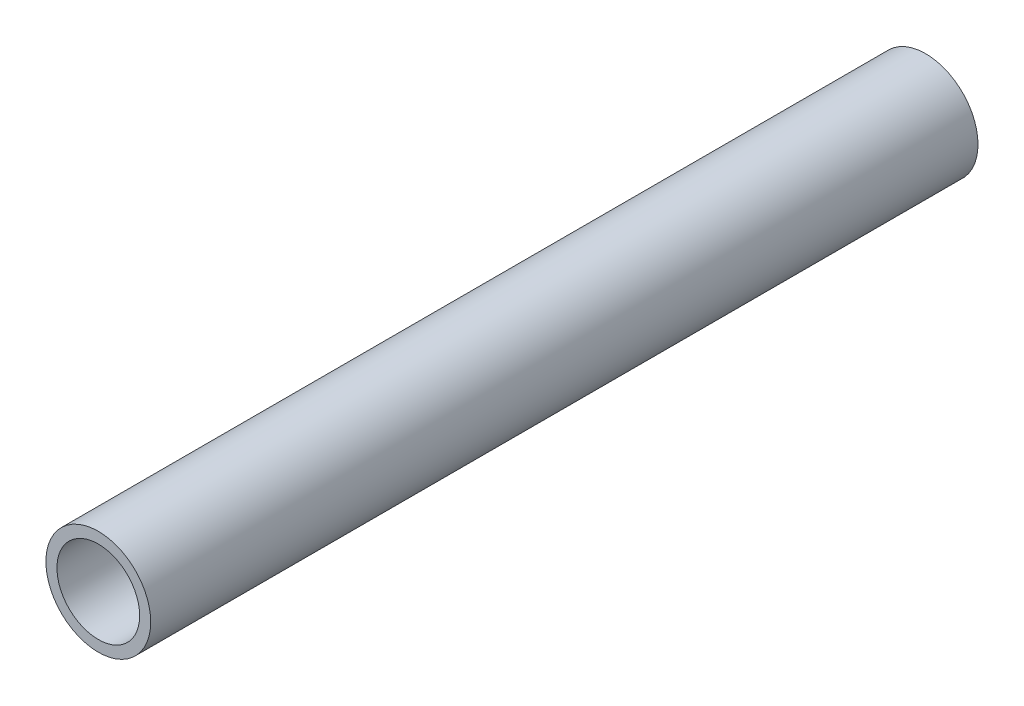
ISO-10303-21;
HEADER;
FILE_DESCRIPTION(('STEP AP214'),'2;1');
FILE_NAME('part.step','',(''),(''),'','','');
FILE_SCHEMA(('AUTOMOTIVE_DESIGN { 1 0 10303 214 1 1 1 1 }'));
ENDSEC;
DATA;
#1=APPLICATION_CONTEXT('core data for automotive mechanical design processes');
#2=APPLICATION_PROTOCOL_DEFINITION('international standard','automotive_design',2000,#1);
#3=PRODUCT_CONTEXT('',#1,'mechanical');
#4=PRODUCT('Part','Part','',(#3));
#5=PRODUCT_RELATED_PRODUCT_CATEGORY('part','',(#4));
#6=PRODUCT_DEFINITION_FORMATION('','',#4);
#7=PRODUCT_DEFINITION_CONTEXT('part definition',#1,'design');
#8=PRODUCT_DEFINITION('design','',#6,#7);
#9=PRODUCT_DEFINITION_SHAPE('','',#8);
#10=(LENGTH_UNIT() NAMED_UNIT(*) SI_UNIT(.MILLI.,.METRE.));
#11=(NAMED_UNIT(*) PLANE_ANGLE_UNIT() SI_UNIT($,.RADIAN.));
#12=(NAMED_UNIT(*) SI_UNIT($,.STERADIAN.) SOLID_ANGLE_UNIT());
#13=UNCERTAINTY_MEASURE_WITH_UNIT(LENGTH_MEASURE(1.E-05),#10,'distance_accuracy_value','');
#14=(GEOMETRIC_REPRESENTATION_CONTEXT(3) GLOBAL_UNCERTAINTY_ASSIGNED_CONTEXT((#13)) GLOBAL_UNIT_ASSIGNED_CONTEXT((#10,
#11,#12)) REPRESENTATION_CONTEXT('',''));
#15=CARTESIAN_POINT('',(0.,0.,0.));
#16=DIRECTION('',(0.,0.,1.));
#17=DIRECTION('',(1.,0.,0.));
#18=AXIS2_PLACEMENT_3D('',#15,#16,#17);
#19=CARTESIAN_POINT('',(0.,0.,300.));
#20=DIRECTION('',(0.,0.,1.));
#21=DIRECTION('',(1.,0.,0.));
#22=AXIS2_PLACEMENT_3D('',#19,#20,#21);
#23=PLANE('',#22);
#24=CARTESIAN_POINT('',(0.,0.,300.));
#25=DIRECTION('',(0.,0.,1.));
#26=DIRECTION('',(1.,0.,0.));
#27=AXIS2_PLACEMENT_3D('',#24,#25,#26);
#28=CIRCLE('',#27,19.);
#29=CARTESIAN_POINT('',(19.,0.,300.));
#30=VERTEX_POINT('',#29);
#31=EDGE_CURVE('E10',#30,#30,#28,.T.);
#32=ORIENTED_EDGE('',*,*,#31,.T.);
#33=EDGE_LOOP('',(#32));
#34=FACE_BOUND('',#33,.T.);
#35=CARTESIAN_POINT('',(0.,0.,300.));
#36=DIRECTION('',(0.,0.,1.));
#37=DIRECTION('',(1.,0.,0.));
#38=AXIS2_PLACEMENT_3D('',#35,#36,#37);
#39=CIRCLE('',#38,15.);
#40=CARTESIAN_POINT('',(15.,0.,300.));
#41=VERTEX_POINT('',#40);
#42=EDGE_CURVE('E52',#41,#41,#39,.T.);
#43=ORIENTED_EDGE('',*,*,#42,.F.);
#44=EDGE_LOOP('',(#43));
#45=FACE_BOUND('',#44,.T.);
#46=ADVANCED_FACE('F39',(#34,#45),#23,.T.);
#47=CARTESIAN_POINT('',(0.,0.,0.));
#48=DIRECTION('',(0.,0.,1.));
#49=DIRECTION('',(1.,0.,0.));
#50=AXIS2_PLACEMENT_3D('',#47,#48,#49);
#51=PLANE('',#50);
#52=CARTESIAN_POINT('',(0.,0.,0.));
#53=DIRECTION('',(0.,0.,1.));
#54=DIRECTION('',(1.,0.,0.));
#55=AXIS2_PLACEMENT_3D('',#52,#53,#54);
#56=CIRCLE('',#55,19.);
#57=CARTESIAN_POINT('',(19.,0.,0.));
#58=VERTEX_POINT('',#57);
#59=EDGE_CURVE('E43',#58,#58,#56,.T.);
#60=ORIENTED_EDGE('',*,*,#59,.F.);
#61=EDGE_LOOP('',(#60));
#62=FACE_BOUND('',#61,.T.);
#63=CARTESIAN_POINT('',(0.,0.,0.));
#64=DIRECTION('',(0.,0.,1.));
#65=DIRECTION('',(1.,0.,0.));
#66=AXIS2_PLACEMENT_3D('',#63,#64,#65);
#67=CIRCLE('',#66,15.);
#68=CARTESIAN_POINT('',(15.,0.,0.));
#69=VERTEX_POINT('',#68);
#70=EDGE_CURVE('E54',#69,#69,#67,.T.);
#71=ORIENTED_EDGE('',*,*,#70,.T.);
#72=EDGE_LOOP('',(#71));
#73=FACE_BOUND('',#72,.T.);
#74=ADVANCED_FACE('F66',(#62,#73),#51,.F.);
#75=CARTESIAN_POINT('',(0.,0.,300.));
#76=DIRECTION('',(0.,0.,-1.));
#77=DIRECTION('',(-1.,0.,0.));
#78=AXIS2_PLACEMENT_3D('',#75,#76,#77);
#79=CYLINDRICAL_SURFACE('',#78,19.);
#80=ORIENTED_EDGE('',*,*,#31,.F.);
#81=EDGE_LOOP('',(#80));
#82=FACE_BOUND('',#81,.T.);
#83=ORIENTED_EDGE('',*,*,#59,.T.);
#84=EDGE_LOOP('',(#83));
#85=FACE_BOUND('',#84,.T.);
#86=ADVANCED_FACE('F41',(#82,#85),#79,.T.);
#87=CARTESIAN_POINT('',(0.,0.,300.));
#88=DIRECTION('',(0.,0.,-1.));
#89=DIRECTION('',(-1.,0.,0.));
#90=AXIS2_PLACEMENT_3D('',#87,#88,#89);
#91=CYLINDRICAL_SURFACE('',#90,15.);
#92=ORIENTED_EDGE('',*,*,#42,.T.);
#93=EDGE_LOOP('',(#92));
#94=FACE_BOUND('',#93,.T.);
#95=ORIENTED_EDGE('',*,*,#70,.F.);
#96=EDGE_LOOP('',(#95));
#97=FACE_BOUND('',#96,.T.);
#98=ADVANCED_FACE('F62',(#94,#97),#91,.F.);
#99=CLOSED_SHELL('',(#46,#74,#86,#98));
#100=MANIFOLD_SOLID_BREP('B2',#99);
#101=ADVANCED_BREP_SHAPE_REPRESENTATION('',(#18,#100),#14);
#102=SHAPE_DEFINITION_REPRESENTATION(#9,#101);
ENDSEC;
END-ISO-10303-21;
